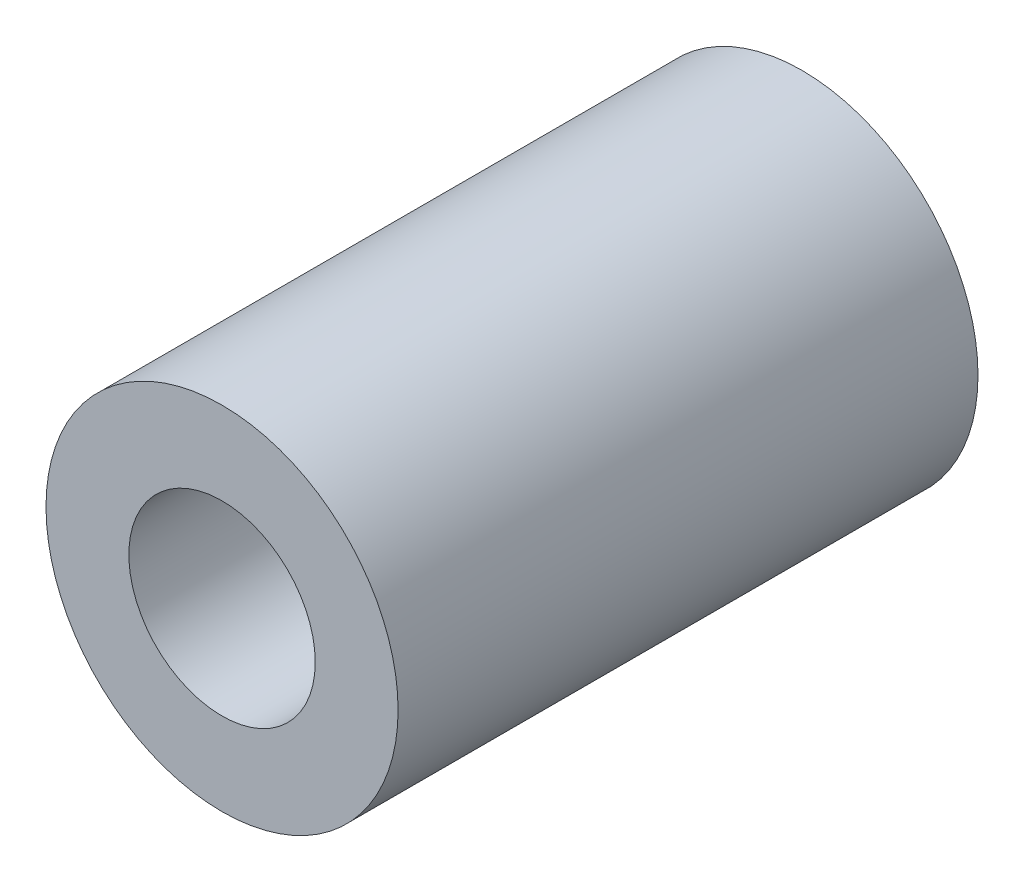
ISO-10303-21;
HEADER;
FILE_DESCRIPTION(('STEP AP214'),'2;1');
FILE_NAME('part.step','',(''),(''),'','','');
FILE_SCHEMA(('AUTOMOTIVE_DESIGN { 1 0 10303 214 1 1 1 1 }'));
ENDSEC;
DATA;
#1=APPLICATION_CONTEXT('core data for automotive mechanical design processes');
#2=APPLICATION_PROTOCOL_DEFINITION('international standard','automotive_design',2000,#1);
#3=PRODUCT_CONTEXT('',#1,'mechanical');
#4=PRODUCT('Part','Part','',(#3));
#5=PRODUCT_RELATED_PRODUCT_CATEGORY('part','',(#4));
#6=PRODUCT_DEFINITION_FORMATION('','',#4);
#7=PRODUCT_DEFINITION_CONTEXT('part definition',#1,'design');
#8=PRODUCT_DEFINITION('design','',#6,#7);
#9=PRODUCT_DEFINITION_SHAPE('','',#8);
#10=(LENGTH_UNIT() NAMED_UNIT(*) SI_UNIT(.MILLI.,.METRE.));
#11=(NAMED_UNIT(*) PLANE_ANGLE_UNIT() SI_UNIT($,.RADIAN.));
#12=(NAMED_UNIT(*) SI_UNIT($,.STERADIAN.) SOLID_ANGLE_UNIT());
#13=UNCERTAINTY_MEASURE_WITH_UNIT(LENGTH_MEASURE(1.E-05),#10,'distance_accuracy_value','');
#14=(GEOMETRIC_REPRESENTATION_CONTEXT(3) GLOBAL_UNCERTAINTY_ASSIGNED_CONTEXT((#13)) GLOBAL_UNIT_ASSIGNED_CONTEXT((#10,
#11,#12)) REPRESENTATION_CONTEXT('',''));
#15=CARTESIAN_POINT('',(0.,0.,0.));
#16=DIRECTION('',(0.,0.,1.));
#17=DIRECTION('',(1.,0.,0.));
#18=AXIS2_PLACEMENT_3D('',#15,#16,#17);
#19=CARTESIAN_POINT('',(0.,0.,28.));
#20=DIRECTION('',(0.,0.,1.));
#21=DIRECTION('',(1.,0.,0.));
#22=AXIS2_PLACEMENT_3D('',#19,#20,#21);
#23=PLANE('',#22);
#24=CARTESIAN_POINT('',(0.,0.,28.));
#25=DIRECTION('',(0.,0.,1.));
#26=DIRECTION('',(1.,0.,0.));
#27=AXIS2_PLACEMENT_3D('',#24,#25,#26);
#28=CIRCLE('',#27,8.5);
#29=CARTESIAN_POINT('',(8.5,0.,28.));
#30=VERTEX_POINT('',#29);
#31=EDGE_CURVE('E10',#30,#30,#28,.T.);
#32=ORIENTED_EDGE('',*,*,#31,.T.);
#33=EDGE_LOOP('',(#32));
#34=FACE_BOUND('',#33,.T.);
#35=CARTESIAN_POINT('',(0.,0.,28.));
#36=DIRECTION('',(0.,0.,1.));
#37=DIRECTION('',(1.,0.,0.));
#38=AXIS2_PLACEMENT_3D('',#35,#36,#37);
#39=CIRCLE('',#38,4.5);
#40=CARTESIAN_POINT('',(4.5,0.,28.));
#41=VERTEX_POINT('',#40);
#42=EDGE_CURVE('E42',#41,#41,#39,.T.);
#43=ORIENTED_EDGE('',*,*,#42,.F.);
#44=EDGE_LOOP('',(#43));
#45=FACE_BOUND('',#44,.T.);
#46=ADVANCED_FACE('F31',(#34,#45),#23,.T.);
#47=CARTESIAN_POINT('',(0.,0.,0.));
#48=DIRECTION('',(0.,0.,1.));
#49=DIRECTION('',(1.,0.,0.));
#50=AXIS2_PLACEMENT_3D('',#47,#48,#49);
#51=PLANE('',#50);
#52=CARTESIAN_POINT('',(0.,0.,0.));
#53=DIRECTION('',(0.,0.,1.));
#54=DIRECTION('',(1.,0.,0.));
#55=AXIS2_PLACEMENT_3D('',#52,#53,#54);
#56=CIRCLE('',#55,8.5);
#57=CARTESIAN_POINT('',(8.5,0.,0.));
#58=VERTEX_POINT('',#57);
#59=EDGE_CURVE('E35',#58,#58,#56,.T.);
#60=ORIENTED_EDGE('',*,*,#59,.F.);
#61=EDGE_LOOP('',(#60));
#62=FACE_BOUND('',#61,.T.);
#63=CARTESIAN_POINT('',(0.,0.,0.));
#64=DIRECTION('',(0.,0.,1.));
#65=DIRECTION('',(1.,0.,0.));
#66=AXIS2_PLACEMENT_3D('',#63,#64,#65);
#67=CIRCLE('',#66,4.5);
#68=CARTESIAN_POINT('',(4.5,0.,0.));
#69=VERTEX_POINT('',#68);
#70=EDGE_CURVE('E44',#69,#69,#67,.T.);
#71=ORIENTED_EDGE('',*,*,#70,.T.);
#72=EDGE_LOOP('',(#71));
#73=FACE_BOUND('',#72,.T.);
#74=ADVANCED_FACE('F54',(#62,#73),#51,.F.);
#75=CARTESIAN_POINT('',(0.,0.,28.));
#76=DIRECTION('',(0.,0.,-1.));
#77=DIRECTION('',(-1.,0.,0.));
#78=AXIS2_PLACEMENT_3D('',#75,#76,#77);
#79=CYLINDRICAL_SURFACE('',#78,8.5);
#80=ORIENTED_EDGE('',*,*,#31,.F.);
#81=EDGE_LOOP('',(#80));
#82=FACE_BOUND('',#81,.T.);
#83=ORIENTED_EDGE('',*,*,#59,.T.);
#84=EDGE_LOOP('',(#83));
#85=FACE_BOUND('',#84,.T.);
#86=ADVANCED_FACE('F33',(#82,#85),#79,.T.);
#87=CARTESIAN_POINT('',(0.,0.,28.));
#88=DIRECTION('',(0.,0.,-1.));
#89=DIRECTION('',(-1.,0.,0.));
#90=AXIS2_PLACEMENT_3D('',#87,#88,#89);
#91=CYLINDRICAL_SURFACE('',#90,4.5);
#92=ORIENTED_EDGE('',*,*,#42,.T.);
#93=EDGE_LOOP('',(#92));
#94=FACE_BOUND('',#93,.T.);
#95=ORIENTED_EDGE('',*,*,#70,.F.);
#96=EDGE_LOOP('',(#95));
#97=FACE_BOUND('',#96,.T.);
#98=ADVANCED_FACE('F50',(#94,#97),#91,.F.);
#99=CLOSED_SHELL('',(#46,#74,#86,#98));
#100=MANIFOLD_SOLID_BREP('B2',#99);
#101=ADVANCED_BREP_SHAPE_REPRESENTATION('',(#18,#100),#14);
#102=SHAPE_DEFINITION_REPRESENTATION(#9,#101);
ENDSEC;
END-ISO-10303-21;
